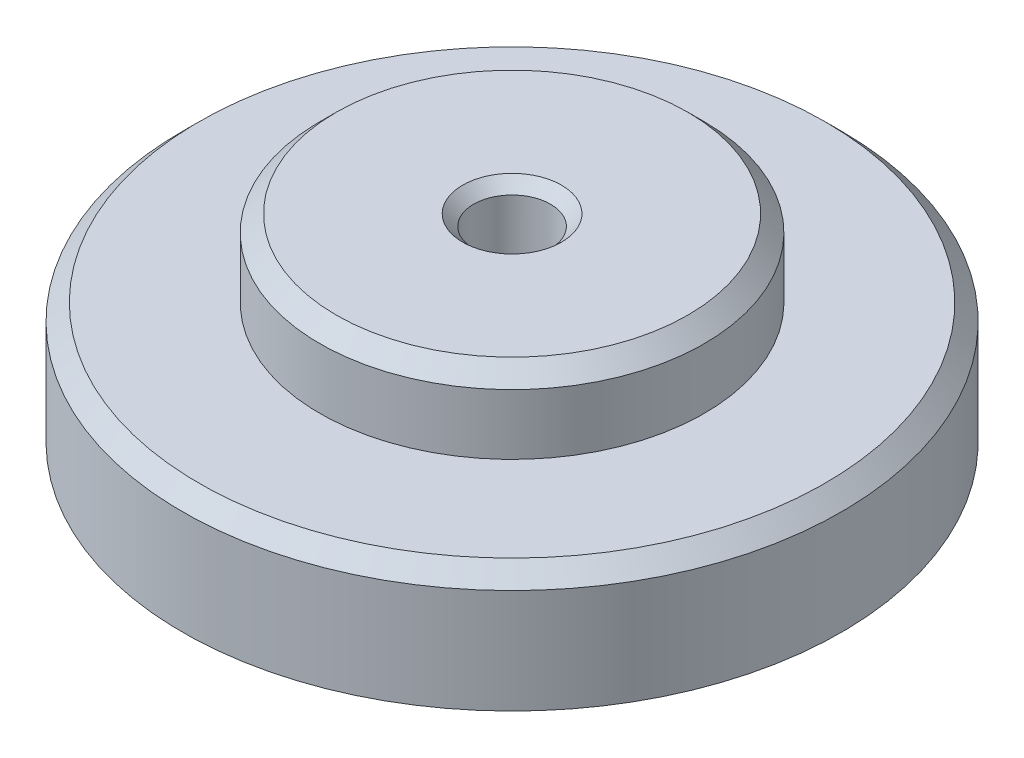
ISO-10303-21;
HEADER;
FILE_DESCRIPTION(('STEP AP214'),'2;1');
FILE_NAME('part.step','',(''),(''),'','','');
FILE_SCHEMA(('AUTOMOTIVE_DESIGN { 1 0 10303 214 1 1 1 1 }'));
ENDSEC;
DATA;
#1=APPLICATION_CONTEXT('core data for automotive mechanical design processes');
#2=APPLICATION_PROTOCOL_DEFINITION('international standard','automotive_design',2000,#1);
#3=PRODUCT_CONTEXT('',#1,'mechanical');
#4=PRODUCT('Part','Part','',(#3));
#5=PRODUCT_RELATED_PRODUCT_CATEGORY('part','',(#4));
#6=PRODUCT_DEFINITION_FORMATION('','',#4);
#7=PRODUCT_DEFINITION_CONTEXT('part definition',#1,'design');
#8=PRODUCT_DEFINITION('design','',#6,#7);
#9=PRODUCT_DEFINITION_SHAPE('','',#8);
#10=(LENGTH_UNIT() NAMED_UNIT(*) SI_UNIT(.MILLI.,.METRE.));
#11=(NAMED_UNIT(*) PLANE_ANGLE_UNIT() SI_UNIT($,.RADIAN.));
#12=(NAMED_UNIT(*) SI_UNIT($,.STERADIAN.) SOLID_ANGLE_UNIT());
#13=UNCERTAINTY_MEASURE_WITH_UNIT(LENGTH_MEASURE(1.E-05),#10,'distance_accuracy_value','');
#14=(GEOMETRIC_REPRESENTATION_CONTEXT(3) GLOBAL_UNCERTAINTY_ASSIGNED_CONTEXT((#13)) GLOBAL_UNIT_ASSIGNED_CONTEXT((#10,
#11,#12)) REPRESENTATION_CONTEXT('',''));
#15=CARTESIAN_POINT('',(0.,0.,0.));
#16=DIRECTION('',(0.,0.,1.));
#17=DIRECTION('',(1.,0.,0.));
#18=AXIS2_PLACEMENT_3D('',#15,#16,#17);
#19=CARTESIAN_POINT('',(0.,22.,0.));
#20=DIRECTION('',(0.,-1.,0.));
#21=DIRECTION('',(0.,0.,-1.));
#22=AXIS2_PLACEMENT_3D('',#19,#20,#21);
#23=CONICAL_SURFACE('',#22,57.,0.785398163397449);
#24=CARTESIAN_POINT('',(0.,19.,0.));
#25=DIRECTION('',(0.,-1.,0.));
#26=DIRECTION('',(0.,0.,-1.));
#27=AXIS2_PLACEMENT_3D('',#24,#25,#26);
#28=CIRCLE('',#27,60.);
#29=CARTESIAN_POINT('',(0.,19.,-60.));
#30=VERTEX_POINT('',#29);
#31=EDGE_CURVE('E70',#30,#30,#28,.T.);
#32=ORIENTED_EDGE('',*,*,#31,.F.);
#33=EDGE_LOOP('',(#32));
#34=FACE_BOUND('',#33,.T.);
#35=CARTESIAN_POINT('',(0.,22.,0.));
#36=DIRECTION('',(0.,-1.,0.));
#37=DIRECTION('',(0.,0.,-1.));
#38=AXIS2_PLACEMENT_3D('',#35,#36,#37);
#39=CIRCLE('',#38,57.);
#40=CARTESIAN_POINT('',(0.,22.,-57.));
#41=VERTEX_POINT('',#40);
#42=EDGE_CURVE('E59',#41,#41,#39,.T.);
#43=ORIENTED_EDGE('',*,*,#42,.T.);
#44=EDGE_LOOP('',(#43));
#45=FACE_BOUND('',#44,.T.);
#46=ADVANCED_FACE('F45',(#34,#45),#23,.T.);
#47=CARTESIAN_POINT('',(0.,22.,0.));
#48=DIRECTION('',(0.,-1.,0.));
#49=DIRECTION('',(0.,0.,-1.));
#50=AXIS2_PLACEMENT_3D('',#47,#48,#49);
#51=PLANE('',#50);
#52=ORIENTED_EDGE('',*,*,#42,.F.);
#53=EDGE_LOOP('',(#52));
#54=FACE_BOUND('',#53,.T.);
#55=CARTESIAN_POINT('',(0.,22.,0.));
#56=DIRECTION('',(0.,-1.,0.));
#57=DIRECTION('',(0.,0.,-1.));
#58=AXIS2_PLACEMENT_3D('',#55,#56,#57);
#59=CIRCLE('',#58,35.);
#60=CARTESIAN_POINT('',(0.,22.,-35.));
#61=VERTEX_POINT('',#60);
#62=EDGE_CURVE('E64',#61,#61,#59,.T.);
#63=ORIENTED_EDGE('',*,*,#62,.T.);
#64=EDGE_LOOP('',(#63));
#65=FACE_BOUND('',#64,.T.);
#66=ADVANCED_FACE('F103',(#54,#65),#51,.F.);
#67=CARTESIAN_POINT('',(0.,0.,0.));
#68=DIRECTION('',(0.,-1.,0.));
#69=DIRECTION('',(0.,0.,-1.));
#70=AXIS2_PLACEMENT_3D('',#67,#68,#69);
#71=CYLINDRICAL_SURFACE('',#70,35.);
#72=ORIENTED_EDGE('',*,*,#62,.F.);
#73=EDGE_LOOP('',(#72));
#74=FACE_BOUND('',#73,.T.);
#75=CARTESIAN_POINT('',(0.,33.,0.));
#76=DIRECTION('',(0.,-1.,0.));
#77=DIRECTION('',(0.,0.,-1.));
#78=AXIS2_PLACEMENT_3D('',#75,#76,#77);
#79=CIRCLE('',#78,35.);
#80=CARTESIAN_POINT('',(0.,33.,-35.));
#81=VERTEX_POINT('',#80);
#82=EDGE_CURVE('E75',#81,#81,#79,.T.);
#83=ORIENTED_EDGE('',*,*,#82,.T.);
#84=EDGE_LOOP('',(#83));
#85=FACE_BOUND('',#84,.T.);
#86=ADVANCED_FACE('F108',(#74,#85),#71,.T.);
#87=CARTESIAN_POINT('',(0.,36.,0.));
#88=DIRECTION('',(0.,-1.,0.));
#89=DIRECTION('',(0.,0.,-1.));
#90=AXIS2_PLACEMENT_3D('',#87,#88,#89);
#91=CONICAL_SURFACE('',#90,32.,0.785398163397448);
#92=ORIENTED_EDGE('',*,*,#82,.F.);
#93=EDGE_LOOP('',(#92));
#94=FACE_BOUND('',#93,.T.);
#95=CARTESIAN_POINT('',(0.,36.,0.));
#96=DIRECTION('',(0.,-1.,0.));
#97=DIRECTION('',(0.,0.,-1.));
#98=AXIS2_PLACEMENT_3D('',#95,#96,#97);
#99=CIRCLE('',#98,32.);
#100=CARTESIAN_POINT('',(0.,36.,-32.));
#101=VERTEX_POINT('',#100);
#102=EDGE_CURVE('E79',#101,#101,#99,.T.);
#103=ORIENTED_EDGE('',*,*,#102,.T.);
#104=EDGE_LOOP('',(#103));
#105=FACE_BOUND('',#104,.T.);
#106=ADVANCED_FACE('F114',(#94,#105),#91,.T.);
#107=CARTESIAN_POINT('',(0.,36.,0.));
#108=DIRECTION('',(0.,-1.,0.));
#109=DIRECTION('',(0.,0.,-1.));
#110=AXIS2_PLACEMENT_3D('',#107,#108,#109);
#111=PLANE('',#110);
#112=CARTESIAN_POINT('',(0.,36.,0.));
#113=DIRECTION('',(0.,-1.,0.));
#114=DIRECTION('',(0.,0.,-1.));
#115=AXIS2_PLACEMENT_3D('',#112,#113,#114);
#116=CIRCLE('',#115,9.00000000000006);
#117=CARTESIAN_POINT('',(0.,36.,-9.00000000000006));
#118=VERTEX_POINT('',#117);
#119=EDGE_CURVE('E10',#118,#118,#116,.T.);
#120=ORIENTED_EDGE('',*,*,#119,.T.);
#121=EDGE_LOOP('',(#120));
#122=FACE_BOUND('',#121,.T.);
#123=ORIENTED_EDGE('',*,*,#102,.F.);
#124=EDGE_LOOP('',(#123));
#125=FACE_BOUND('',#124,.T.);
#126=ADVANCED_FACE('F120',(#122,#125),#111,.F.);
#127=CARTESIAN_POINT('',(0.,11.,0.));
#128=DIRECTION('',(0.,1.,0.));
#129=DIRECTION('',(0.,0.,1.));
#130=AXIS2_PLACEMENT_3D('',#127,#128,#129);
#131=PLANE('',#130);
#132=CARTESIAN_POINT('',(0.,11.,0.));
#133=DIRECTION('',(0.,1.,0.));
#134=DIRECTION('',(0.,0.,1.));
#135=AXIS2_PLACEMENT_3D('',#132,#133,#134);
#136=CIRCLE('',#135,7.);
#137=CARTESIAN_POINT('',(0.,11.,7.));
#138=VERTEX_POINT('',#137);
#139=EDGE_CURVE('E67',#138,#138,#136,.T.);
#140=ORIENTED_EDGE('',*,*,#139,.T.);
#141=EDGE_LOOP('',(#140));
#142=FACE_BOUND('',#141,.T.);
#143=CARTESIAN_POINT('',(0.,11.,0.));
#144=DIRECTION('',(0.,-1.,0.));
#145=DIRECTION('',(0.,0.,-1.));
#146=AXIS2_PLACEMENT_3D('',#143,#144,#145);
#147=CIRCLE('',#146,45.);
#148=CARTESIAN_POINT('',(0.,11.,-45.));
#149=VERTEX_POINT('',#148);
#150=EDGE_CURVE('E83',#149,#149,#147,.T.);
#151=ORIENTED_EDGE('',*,*,#150,.T.);
#152=EDGE_LOOP('',(#151));
#153=FACE_BOUND('',#152,.T.);
#154=ADVANCED_FACE('F125',(#142,#153),#131,.F.);
#155=CARTESIAN_POINT('',(0.,0.,0.));
#156=DIRECTION('',(0.,-1.,0.));
#157=DIRECTION('',(0.,0.,-1.));
#158=AXIS2_PLACEMENT_3D('',#155,#156,#157);
#159=CYLINDRICAL_SURFACE('',#158,45.);
#160=ORIENTED_EDGE('',*,*,#150,.F.);
#161=EDGE_LOOP('',(#160));
#162=FACE_BOUND('',#161,.T.);
#163=CARTESIAN_POINT('',(0.,0.,0.));
#164=DIRECTION('',(0.,-1.,0.));
#165=DIRECTION('',(0.,0.,-1.));
#166=AXIS2_PLACEMENT_3D('',#163,#164,#165);
#167=CIRCLE('',#166,45.);
#168=CARTESIAN_POINT('',(0.,0.,-45.));
#169=VERTEX_POINT('',#168);
#170=EDGE_CURVE('E87',#169,#169,#167,.T.);
#171=ORIENTED_EDGE('',*,*,#170,.T.);
#172=EDGE_LOOP('',(#171));
#173=FACE_BOUND('',#172,.T.);
#174=ADVANCED_FACE('F130',(#162,#173),#159,.F.);
#175=CARTESIAN_POINT('',(0.,0.,0.));
#176=DIRECTION('',(0.,1.,0.));
#177=DIRECTION('',(0.,0.,1.));
#178=AXIS2_PLACEMENT_3D('',#175,#176,#177);
#179=PLANE('',#178);
#180=ORIENTED_EDGE('',*,*,#170,.F.);
#181=EDGE_LOOP('',(#180));
#182=FACE_BOUND('',#181,.T.);
#183=CARTESIAN_POINT('',(0.,0.,0.));
#184=DIRECTION('',(0.,-1.,0.));
#185=DIRECTION('',(0.,0.,-1.));
#186=AXIS2_PLACEMENT_3D('',#183,#184,#185);
#187=CIRCLE('',#186,60.);
#188=CARTESIAN_POINT('',(0.,0.,-60.));
#189=VERTEX_POINT('',#188);
#190=EDGE_CURVE('E91',#189,#189,#187,.T.);
#191=ORIENTED_EDGE('',*,*,#190,.T.);
#192=EDGE_LOOP('',(#191));
#193=FACE_BOUND('',#192,.T.);
#194=ADVANCED_FACE('F136',(#182,#193),#179,.F.);
#195=CARTESIAN_POINT('',(0.,0.,0.));
#196=DIRECTION('',(0.,-1.,0.));
#197=DIRECTION('',(0.,0.,-1.));
#198=AXIS2_PLACEMENT_3D('',#195,#196,#197);
#199=CYLINDRICAL_SURFACE('',#198,60.);
#200=ORIENTED_EDGE('',*,*,#190,.F.);
#201=EDGE_LOOP('',(#200));
#202=FACE_BOUND('',#201,.T.);
#203=ORIENTED_EDGE('',*,*,#31,.T.);
#204=EDGE_LOOP('',(#203));
#205=FACE_BOUND('',#204,.T.);
#206=ADVANCED_FACE('F99',(#202,#205),#199,.T.);
#207=CARTESIAN_POINT('',(0.,36.,0.));
#208=DIRECTION('',(0.,1.,0.));
#209=DIRECTION('',(0.,0.,1.));
#210=AXIS2_PLACEMENT_3D('',#207,#208,#209);
#211=CYLINDRICAL_SURFACE('',#210,7.);
#212=CARTESIAN_POINT('',(0.,33.9999999999999,0.));
#213=DIRECTION('',(0.,-1.,0.));
#214=DIRECTION('',(0.,0.,-1.));
#215=AXIS2_PLACEMENT_3D('',#212,#213,#214);
#216=CIRCLE('',#215,7.);
#217=CARTESIAN_POINT('',(0.,33.9999999999999,-7.));
#218=VERTEX_POINT('',#217);
#219=EDGE_CURVE('E54',#218,#218,#216,.F.);
#220=ORIENTED_EDGE('',*,*,#219,.T.);
#221=EDGE_LOOP('',(#220));
#222=FACE_BOUND('',#221,.T.);
#223=ORIENTED_EDGE('',*,*,#139,.F.);
#224=EDGE_LOOP('',(#223));
#225=FACE_BOUND('',#224,.T.);
#226=ADVANCED_FACE('F143',(#222,#225),#211,.F.);
#227=CARTESIAN_POINT('',(0.,33.9999999999999,0.));
#228=DIRECTION('',(0.,1.,0.));
#229=DIRECTION('',(0.,0.,1.));
#230=AXIS2_PLACEMENT_3D('',#227,#228,#229);
#231=CONICAL_SURFACE('',#230,7.,0.785398163397449);
#232=ORIENTED_EDGE('',*,*,#119,.F.);
#233=EDGE_LOOP('',(#232));
#234=FACE_BOUND('',#233,.T.);
#235=ORIENTED_EDGE('',*,*,#219,.F.);
#236=EDGE_LOOP('',(#235));
#237=FACE_BOUND('',#236,.T.);
#238=ADVANCED_FACE('F48',(#234,#237),#231,.F.);
#239=CLOSED_SHELL('',(#46,#66,#86,#106,#126,#154,#174,#194,#206,#226,#238));
#240=MANIFOLD_SOLID_BREP('B2',#239);
#241=ADVANCED_BREP_SHAPE_REPRESENTATION('',(#18,#240),#14);
#242=SHAPE_DEFINITION_REPRESENTATION(#9,#241);
ENDSEC;
END-ISO-10303-21;
